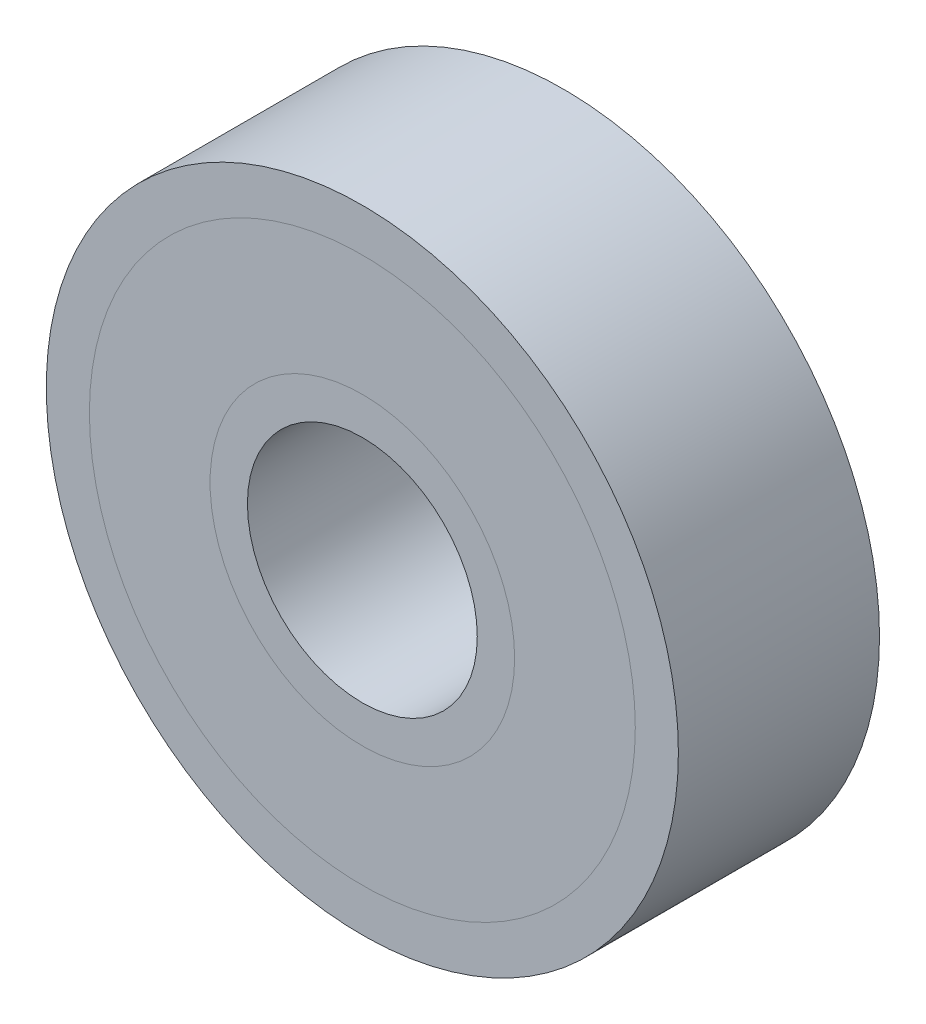
ISO-10303-21;
HEADER;
FILE_DESCRIPTION(('STEP AP214'),'2;1');
FILE_NAME('part.step','',(''),(''),'','','');
FILE_SCHEMA(('AUTOMOTIVE_DESIGN { 1 0 10303 214 1 1 1 1 }'));
ENDSEC;
DATA;
#1=APPLICATION_CONTEXT('core data for automotive mechanical design processes');
#2=APPLICATION_PROTOCOL_DEFINITION('international standard','automotive_design',2000,#1);
#3=PRODUCT_CONTEXT('',#1,'mechanical');
#4=PRODUCT('Part','Part','',(#3));
#5=PRODUCT_RELATED_PRODUCT_CATEGORY('part','',(#4));
#6=PRODUCT_DEFINITION_FORMATION('','',#4);
#7=PRODUCT_DEFINITION_CONTEXT('part definition',#1,'design');
#8=PRODUCT_DEFINITION('design','',#6,#7);
#9=PRODUCT_DEFINITION_SHAPE('','',#8);
#10=(LENGTH_UNIT() NAMED_UNIT(*) SI_UNIT(.MILLI.,.METRE.));
#11=(NAMED_UNIT(*) PLANE_ANGLE_UNIT() SI_UNIT($,.RADIAN.));
#12=(NAMED_UNIT(*) SI_UNIT($,.STERADIAN.) SOLID_ANGLE_UNIT());
#13=UNCERTAINTY_MEASURE_WITH_UNIT(LENGTH_MEASURE(1.E-05),#10,'distance_accuracy_value','');
#14=(GEOMETRIC_REPRESENTATION_CONTEXT(3) GLOBAL_UNCERTAINTY_ASSIGNED_CONTEXT((#13)) GLOBAL_UNIT_ASSIGNED_CONTEXT((#10,
#11,#12)) REPRESENTATION_CONTEXT('',''));
#15=CARTESIAN_POINT('',(0.,0.,0.));
#16=DIRECTION('',(0.,0.,1.));
#17=DIRECTION('',(1.,0.,0.));
#18=AXIS2_PLACEMENT_3D('',#15,#16,#17);
#19=CARTESIAN_POINT('',(-0.530005847372544,-0.048182349761066,14.1));
#20=DIRECTION('',(0.,0.,1.));
#21=DIRECTION('',(1.,0.,0.));
#22=AXIS2_PLACEMENT_3D('',#19,#20,#21);
#23=PLANE('',#22);
#24=CARTESIAN_POINT('',(-0.530005847372544,-0.048182349761066,14.1));
#25=DIRECTION('',(0.,0.,1.));
#26=DIRECTION('',(1.,0.,0.));
#27=AXIS2_PLACEMENT_3D('',#24,#25,#26);
#28=CIRCLE('',#27,11.);
#29=CARTESIAN_POINT('',(10.4699941526275,-0.048182349761066,14.1));
#30=VERTEX_POINT('',#29);
#31=EDGE_CURVE('P0_E10',#30,#30,#28,.T.);
#32=ORIENTED_EDGE('',*,*,#31,.T.);
#33=EDGE_LOOP('',(#32));
#34=FACE_BOUND('',#33,.T.);
#35=CARTESIAN_POINT('',(-0.530005847372544,-0.048182349761066,14.1));
#36=DIRECTION('',(0.,0.,1.));
#37=DIRECTION('',(1.,0.,0.));
#38=AXIS2_PLACEMENT_3D('',#35,#36,#37);
#39=CIRCLE('',#38,9.5);
#40=CARTESIAN_POINT('',(8.96999415262746,-0.048182349761066,14.1));
#41=VERTEX_POINT('',#40);
#42=EDGE_CURVE('P0_E25',#41,#41,#39,.T.);
#43=ORIENTED_EDGE('',*,*,#42,.F.);
#44=EDGE_LOOP('',(#43));
#45=FACE_BOUND('',#44,.T.);
#46=ADVANCED_FACE('P0_F14',(#34,#45),#23,.T.);
#47=CARTESIAN_POINT('',(-0.530005847372544,-0.048182349761066,7.1));
#48=DIRECTION('',(0.,0.,1.));
#49=DIRECTION('',(1.,0.,0.));
#50=AXIS2_PLACEMENT_3D('',#47,#48,#49);
#51=PLANE('',#50);
#52=CARTESIAN_POINT('',(-0.530005847372544,-0.048182349761066,7.1));
#53=DIRECTION('',(0.,0.,1.));
#54=DIRECTION('',(1.,0.,0.));
#55=AXIS2_PLACEMENT_3D('',#52,#53,#54);
#56=CIRCLE('',#55,11.);
#57=CARTESIAN_POINT('',(10.4699941526275,-0.048182349761066,7.1));
#58=VERTEX_POINT('',#57);
#59=EDGE_CURVE('P0_E18',#58,#58,#56,.T.);
#60=ORIENTED_EDGE('',*,*,#59,.F.);
#61=EDGE_LOOP('',(#60));
#62=FACE_BOUND('',#61,.T.);
#63=CARTESIAN_POINT('',(-0.530005847372544,-0.048182349761066,7.1));
#64=DIRECTION('',(0.,0.,1.));
#65=DIRECTION('',(1.,0.,0.));
#66=AXIS2_PLACEMENT_3D('',#63,#64,#65);
#67=CIRCLE('',#66,9.5);
#68=CARTESIAN_POINT('',(8.96999415262746,-0.048182349761066,7.1));
#69=VERTEX_POINT('',#68);
#70=EDGE_CURVE('P0_E27',#69,#69,#67,.T.);
#71=ORIENTED_EDGE('',*,*,#70,.T.);
#72=EDGE_LOOP('',(#71));
#73=FACE_BOUND('',#72,.T.);
#74=ADVANCED_FACE('P0_F37',(#62,#73),#51,.F.);
#75=CARTESIAN_POINT('',(-0.530005847372544,-0.048182349761066,14.1));
#76=DIRECTION('',(0.,0.,-1.));
#77=DIRECTION('',(-1.,0.,0.));
#78=AXIS2_PLACEMENT_3D('',#75,#76,#77);
#79=CYLINDRICAL_SURFACE('',#78,11.);
#80=ORIENTED_EDGE('',*,*,#31,.F.);
#81=EDGE_LOOP('',(#80));
#82=FACE_BOUND('',#81,.T.);
#83=ORIENTED_EDGE('',*,*,#59,.T.);
#84=EDGE_LOOP('',(#83));
#85=FACE_BOUND('',#84,.T.);
#86=ADVANCED_FACE('P0_F16',(#82,#85),#79,.T.);
#87=CARTESIAN_POINT('',(-0.530005847372544,-0.048182349761066,14.1));
#88=DIRECTION('',(0.,0.,-1.));
#89=DIRECTION('',(-1.,0.,0.));
#90=AXIS2_PLACEMENT_3D('',#87,#88,#89);
#91=CYLINDRICAL_SURFACE('',#90,9.5);
#92=ORIENTED_EDGE('',*,*,#42,.T.);
#93=EDGE_LOOP('',(#92));
#94=FACE_BOUND('',#93,.T.);
#95=ORIENTED_EDGE('',*,*,#70,.F.);
#96=EDGE_LOOP('',(#95));
#97=FACE_BOUND('',#96,.T.);
#98=ADVANCED_FACE('P0_F33',(#94,#97),#91,.F.);
#99=CLOSED_SHELL('',(#46,#74,#86,#98));
#100=MANIFOLD_SOLID_BREP('P0_B1',#99);
#101=CARTESIAN_POINT('',(-0.530005847372544,-0.0481823497610661,14.1));
#102=DIRECTION('',(0.,0.,1.));
#103=DIRECTION('',(1.,0.,0.));
#104=AXIS2_PLACEMENT_3D('',#101,#102,#103);
#105=PLANE('',#104);
#106=CARTESIAN_POINT('',(-0.530005847372544,-0.0481823497610661,14.1));
#107=DIRECTION('',(0.,0.,1.));
#108=DIRECTION('',(1.,0.,0.));
#109=AXIS2_PLACEMENT_3D('',#106,#107,#108);
#110=CIRCLE('',#109,5.3);
#111=CARTESIAN_POINT('',(4.76999415262746,-0.0481823497610661,14.1));
#112=VERTEX_POINT('',#111);
#113=EDGE_CURVE('P1_E10',#112,#112,#110,.T.);
#114=ORIENTED_EDGE('',*,*,#113,.T.);
#115=EDGE_LOOP('',(#114));
#116=FACE_BOUND('',#115,.T.);
#117=CARTESIAN_POINT('',(-0.530005847372544,-0.0481823497610661,14.1));
#118=DIRECTION('',(0.,0.,1.));
#119=DIRECTION('',(1.,0.,0.));
#120=AXIS2_PLACEMENT_3D('',#117,#118,#119);
#121=CIRCLE('',#120,4.);
#122=CARTESIAN_POINT('',(3.46999415262746,-0.0481823497610661,14.1));
#123=VERTEX_POINT('',#122);
#124=EDGE_CURVE('P1_E25',#123,#123,#121,.T.);
#125=ORIENTED_EDGE('',*,*,#124,.F.);
#126=EDGE_LOOP('',(#125));
#127=FACE_BOUND('',#126,.T.);
#128=ADVANCED_FACE('P1_F14',(#116,#127),#105,.T.);
#129=CARTESIAN_POINT('',(-0.530005847372544,-0.0481823497610661,7.1));
#130=DIRECTION('',(0.,0.,1.));
#131=DIRECTION('',(1.,0.,0.));
#132=AXIS2_PLACEMENT_3D('',#129,#130,#131);
#133=PLANE('',#132);
#134=CARTESIAN_POINT('',(-0.530005847372544,-0.0481823497610661,7.1));
#135=DIRECTION('',(0.,0.,1.));
#136=DIRECTION('',(1.,0.,0.));
#137=AXIS2_PLACEMENT_3D('',#134,#135,#136);
#138=CIRCLE('',#137,5.3);
#139=CARTESIAN_POINT('',(4.76999415262746,-0.0481823497610661,7.1));
#140=VERTEX_POINT('',#139);
#141=EDGE_CURVE('P1_E18',#140,#140,#138,.T.);
#142=ORIENTED_EDGE('',*,*,#141,.F.);
#143=EDGE_LOOP('',(#142));
#144=FACE_BOUND('',#143,.T.);
#145=CARTESIAN_POINT('',(-0.530005847372544,-0.0481823497610661,7.1));
#146=DIRECTION('',(0.,0.,1.));
#147=DIRECTION('',(1.,0.,0.));
#148=AXIS2_PLACEMENT_3D('',#145,#146,#147);
#149=CIRCLE('',#148,4.);
#150=CARTESIAN_POINT('',(3.46999415262746,-0.0481823497610661,7.1));
#151=VERTEX_POINT('',#150);
#152=EDGE_CURVE('P1_E27',#151,#151,#149,.T.);
#153=ORIENTED_EDGE('',*,*,#152,.T.);
#154=EDGE_LOOP('',(#153));
#155=FACE_BOUND('',#154,.T.);
#156=ADVANCED_FACE('P1_F37',(#144,#155),#133,.F.);
#157=CARTESIAN_POINT('',(-0.530005847372544,-0.0481823497610661,14.1));
#158=DIRECTION('',(0.,0.,-1.));
#159=DIRECTION('',(-1.,0.,0.));
#160=AXIS2_PLACEMENT_3D('',#157,#158,#159);
#161=CYLINDRICAL_SURFACE('',#160,5.3);
#162=ORIENTED_EDGE('',*,*,#113,.F.);
#163=EDGE_LOOP('',(#162));
#164=FACE_BOUND('',#163,.T.);
#165=ORIENTED_EDGE('',*,*,#141,.T.);
#166=EDGE_LOOP('',(#165));
#167=FACE_BOUND('',#166,.T.);
#168=ADVANCED_FACE('P1_F16',(#164,#167),#161,.T.);
#169=CARTESIAN_POINT('',(-0.530005847372544,-0.0481823497610661,14.1));
#170=DIRECTION('',(0.,0.,-1.));
#171=DIRECTION('',(-1.,0.,0.));
#172=AXIS2_PLACEMENT_3D('',#169,#170,#171);
#173=CYLINDRICAL_SURFACE('',#172,4.);
#174=ORIENTED_EDGE('',*,*,#124,.T.);
#175=EDGE_LOOP('',(#174));
#176=FACE_BOUND('',#175,.T.);
#177=ORIENTED_EDGE('',*,*,#152,.F.);
#178=EDGE_LOOP('',(#177));
#179=FACE_BOUND('',#178,.T.);
#180=ADVANCED_FACE('P1_F33',(#176,#179),#173,.F.);
#181=CLOSED_SHELL('',(#128,#156,#168,#180));
#182=MANIFOLD_SOLID_BREP('P1_B1',#181);
#183=CARTESIAN_POINT('',(-0.530005847372544,-0.0481823497610661,14.1));
#184=DIRECTION('',(0.,0.,1.));
#185=DIRECTION('',(1.,0.,0.));
#186=AXIS2_PLACEMENT_3D('',#183,#184,#185);
#187=PLANE('',#186);
#188=CARTESIAN_POINT('',(-0.530005847372544,-0.0481823497610661,14.1));
#189=DIRECTION('',(0.,0.,1.));
#190=DIRECTION('',(1.,0.,0.));
#191=AXIS2_PLACEMENT_3D('',#188,#189,#190);
#192=CIRCLE('',#191,9.5);
#193=CARTESIAN_POINT('',(8.96999415262746,-0.0481823497610661,14.1));
#194=VERTEX_POINT('',#193);
#195=EDGE_CURVE('P2_E10',#194,#194,#192,.T.);
#196=ORIENTED_EDGE('',*,*,#195,.T.);
#197=EDGE_LOOP('',(#196));
#198=FACE_BOUND('',#197,.T.);
#199=CARTESIAN_POINT('',(-0.530005847372544,-0.0481823497610661,14.1));
#200=DIRECTION('',(0.,0.,1.));
#201=DIRECTION('',(1.,0.,0.));
#202=AXIS2_PLACEMENT_3D('',#199,#200,#201);
#203=CIRCLE('',#202,5.3);
#204=CARTESIAN_POINT('',(4.76999415262746,-0.0481823497610661,14.1));
#205=VERTEX_POINT('',#204);
#206=EDGE_CURVE('P2_E25',#205,#205,#203,.T.);
#207=ORIENTED_EDGE('',*,*,#206,.F.);
#208=EDGE_LOOP('',(#207));
#209=FACE_BOUND('',#208,.T.);
#210=ADVANCED_FACE('P2_F14',(#198,#209),#187,.T.);
#211=CARTESIAN_POINT('',(-0.530005847372544,-0.0481823497610661,7.1));
#212=DIRECTION('',(0.,0.,1.));
#213=DIRECTION('',(1.,0.,0.));
#214=AXIS2_PLACEMENT_3D('',#211,#212,#213);
#215=PLANE('',#214);
#216=CARTESIAN_POINT('',(-0.530005847372544,-0.0481823497610661,7.1));
#217=DIRECTION('',(0.,0.,1.));
#218=DIRECTION('',(1.,0.,0.));
#219=AXIS2_PLACEMENT_3D('',#216,#217,#218);
#220=CIRCLE('',#219,9.5);
#221=CARTESIAN_POINT('',(8.96999415262746,-0.0481823497610661,7.1));
#222=VERTEX_POINT('',#221);
#223=EDGE_CURVE('P2_E18',#222,#222,#220,.T.);
#224=ORIENTED_EDGE('',*,*,#223,.F.);
#225=EDGE_LOOP('',(#224));
#226=FACE_BOUND('',#225,.T.);
#227=CARTESIAN_POINT('',(-0.530005847372544,-0.0481823497610661,7.1));
#228=DIRECTION('',(0.,0.,1.));
#229=DIRECTION('',(1.,0.,0.));
#230=AXIS2_PLACEMENT_3D('',#227,#228,#229);
#231=CIRCLE('',#230,5.3);
#232=CARTESIAN_POINT('',(4.76999415262746,-0.0481823497610661,7.1));
#233=VERTEX_POINT('',#232);
#234=EDGE_CURVE('P2_E27',#233,#233,#231,.T.);
#235=ORIENTED_EDGE('',*,*,#234,.T.);
#236=EDGE_LOOP('',(#235));
#237=FACE_BOUND('',#236,.T.);
#238=ADVANCED_FACE('P2_F37',(#226,#237),#215,.F.);
#239=CARTESIAN_POINT('',(-0.530005847372544,-0.0481823497610661,14.1));
#240=DIRECTION('',(0.,0.,-1.));
#241=DIRECTION('',(-1.,0.,0.));
#242=AXIS2_PLACEMENT_3D('',#239,#240,#241);
#243=CYLINDRICAL_SURFACE('',#242,9.5);
#244=ORIENTED_EDGE('',*,*,#195,.F.);
#245=EDGE_LOOP('',(#244));
#246=FACE_BOUND('',#245,.T.);
#247=ORIENTED_EDGE('',*,*,#223,.T.);
#248=EDGE_LOOP('',(#247));
#249=FACE_BOUND('',#248,.T.);
#250=ADVANCED_FACE('P2_F16',(#246,#249),#243,.T.);
#251=CARTESIAN_POINT('',(-0.530005847372544,-0.0481823497610661,14.1));
#252=DIRECTION('',(0.,0.,-1.));
#253=DIRECTION('',(-1.,0.,0.));
#254=AXIS2_PLACEMENT_3D('',#251,#252,#253);
#255=CYLINDRICAL_SURFACE('',#254,5.3);
#256=ORIENTED_EDGE('',*,*,#206,.T.);
#257=EDGE_LOOP('',(#256));
#258=FACE_BOUND('',#257,.T.);
#259=ORIENTED_EDGE('',*,*,#234,.F.);
#260=EDGE_LOOP('',(#259));
#261=FACE_BOUND('',#260,.T.);
#262=ADVANCED_FACE('P2_F33',(#258,#261),#255,.F.);
#263=CLOSED_SHELL('',(#210,#238,#250,#262));
#264=MANIFOLD_SOLID_BREP('P2_B1',#263);
#265=ADVANCED_BREP_SHAPE_REPRESENTATION('',(#18,#100,#182,#264),#14);
#266=SHAPE_DEFINITION_REPRESENTATION(#9,#265);
ENDSEC;
END-ISO-10303-21;
